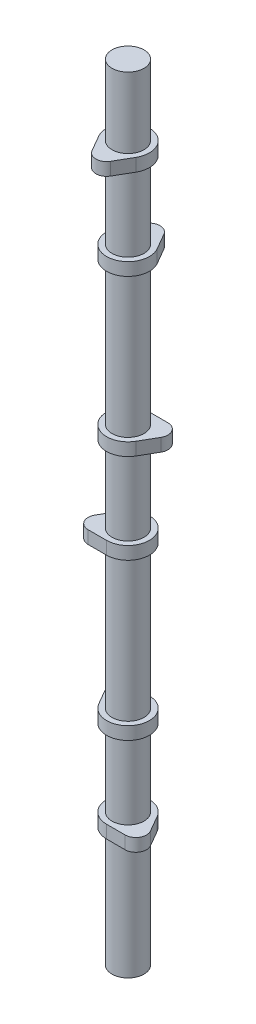
ISO-10303-21;
HEADER;
FILE_DESCRIPTION(('STEP AP214'),'2;1');
FILE_NAME('part.step','',(''),(''),'','','');
FILE_SCHEMA(('AUTOMOTIVE_DESIGN { 1 0 10303 214 1 1 1 1 }'));
ENDSEC;
DATA;
#1=APPLICATION_CONTEXT('core data for automotive mechanical design processes');
#2=APPLICATION_PROTOCOL_DEFINITION('international standard','automotive_design',2000,#1);
#3=PRODUCT_CONTEXT('',#1,'mechanical');
#4=PRODUCT('Part','Part','',(#3));
#5=PRODUCT_RELATED_PRODUCT_CATEGORY('part','',(#4));
#6=PRODUCT_DEFINITION_FORMATION('','',#4);
#7=PRODUCT_DEFINITION_CONTEXT('part definition',#1,'design');
#8=PRODUCT_DEFINITION('design','',#6,#7);
#9=PRODUCT_DEFINITION_SHAPE('','',#8);
#10=(LENGTH_UNIT() NAMED_UNIT(*) SI_UNIT(.MILLI.,.METRE.));
#11=(NAMED_UNIT(*) PLANE_ANGLE_UNIT() SI_UNIT($,.RADIAN.));
#12=(NAMED_UNIT(*) SI_UNIT($,.STERADIAN.) SOLID_ANGLE_UNIT());
#13=UNCERTAINTY_MEASURE_WITH_UNIT(LENGTH_MEASURE(1.E-05),#10,'distance_accuracy_value','');
#14=(GEOMETRIC_REPRESENTATION_CONTEXT(3) GLOBAL_UNCERTAINTY_ASSIGNED_CONTEXT((#13)) GLOBAL_UNIT_ASSIGNED_CONTEXT((#10,
#11,#12)) REPRESENTATION_CONTEXT('',''));
#15=CARTESIAN_POINT('',(0.,0.,0.));
#16=DIRECTION('',(0.,0.,1.));
#17=DIRECTION('',(1.,0.,0.));
#18=AXIS2_PLACEMENT_3D('',#15,#16,#17);
#19=CARTESIAN_POINT('',(0.,-363.22,0.));
#20=DIRECTION('',(0.,1.,0.));
#21=DIRECTION('',(0.,0.,1.));
#22=AXIS2_PLACEMENT_3D('',#19,#20,#21);
#23=CYLINDRICAL_SURFACE('',#22,9.5);
#24=CARTESIAN_POINT('',(0.,7.62000000000002,0.));
#25=DIRECTION('',(0.,1.,0.));
#26=DIRECTION('',(0.,0.,1.));
#27=AXIS2_PLACEMENT_3D('',#24,#25,#26);
#28=CIRCLE('',#27,9.5);
#29=CARTESIAN_POINT('',(0.,7.62000000000002,9.5));
#30=VERTEX_POINT('',#29);
#31=EDGE_CURVE('E434',#30,#30,#28,.T.);
#32=ORIENTED_EDGE('',*,*,#31,.T.);
#33=EDGE_LOOP('',(#32));
#34=FACE_BOUND('',#33,.T.);
#35=CARTESIAN_POINT('',(0.,53.34,0.));
#36=DIRECTION('',(0.,1.,0.));
#37=DIRECTION('',(0.,0.,1.));
#38=AXIS2_PLACEMENT_3D('',#35,#36,#37);
#39=CIRCLE('',#38,9.5);
#40=CARTESIAN_POINT('',(0.,53.34,9.5));
#41=VERTEX_POINT('',#40);
#42=EDGE_CURVE('E424',#41,#41,#39,.F.);
#43=ORIENTED_EDGE('',*,*,#42,.T.);
#44=EDGE_LOOP('',(#43));
#45=FACE_BOUND('',#44,.T.);
#46=ADVANCED_FACE('F43',(#34,#45),#23,.T.);
#47=CARTESIAN_POINT('',(0.,7.62,0.));
#48=DIRECTION('',(0.,-1.,0.));
#49=DIRECTION('',(0.,0.,-1.));
#50=AXIS2_PLACEMENT_3D('',#47,#48,#49);
#51=CYLINDRICAL_SURFACE('',#50,12.7);
#52=CARTESIAN_POINT('',(0.,0.,0.));
#53=DIRECTION('',(0.,1.,0.));
#54=DIRECTION('',(0.,0.,1.));
#55=AXIS2_PLACEMENT_3D('',#52,#53,#54);
#56=CIRCLE('',#55,12.7);
#57=CARTESIAN_POINT('',(-10.9985226280624,0.,-6.35));
#58=VERTEX_POINT('',#57);
#59=CARTESIAN_POINT('',(10.9985226280624,0.,-6.35));
#60=VERTEX_POINT('',#59);
#61=EDGE_CURVE('E451',#58,#60,#56,.T.);
#62=ORIENTED_EDGE('',*,*,#61,.T.);
#63=DIRECTION('',(0.,-1.,0.));
#64=VECTOR('',#63,1.);
#65=CARTESIAN_POINT('',(10.9985226280624,7.62,-6.35));
#66=LINE('',#65,#64);
#67=CARTESIAN_POINT('',(10.9985226280624,7.62,-6.35));
#68=VERTEX_POINT('',#67);
#69=EDGE_CURVE('E439',#68,#60,#66,.T.);
#70=ORIENTED_EDGE('',*,*,#69,.F.);
#71=CARTESIAN_POINT('',(0.,7.62,0.));
#72=DIRECTION('',(0.,1.,0.));
#73=DIRECTION('',(0.,0.,1.));
#74=AXIS2_PLACEMENT_3D('',#71,#72,#73);
#75=CIRCLE('',#74,12.7);
#76=CARTESIAN_POINT('',(-10.9985226280624,7.62,-6.35));
#77=VERTEX_POINT('',#76);
#78=EDGE_CURVE('E440',#77,#68,#75,.T.);
#79=ORIENTED_EDGE('',*,*,#78,.F.);
#80=DIRECTION('',(0.,-1.,0.));
#81=VECTOR('',#80,1.);
#82=CARTESIAN_POINT('',(-10.9985226280624,7.62,-6.35));
#83=LINE('',#82,#81);
#84=EDGE_CURVE('E450',#77,#58,#83,.T.);
#85=ORIENTED_EDGE('',*,*,#84,.T.);
#86=EDGE_LOOP('',(#62,#70,#79,#85));
#87=FACE_BOUND('',#86,.T.);
#88=ADVANCED_FACE('F45',(#87),#51,.T.);
#89=CARTESIAN_POINT('',(10.9985226280624,7.62,-6.35));
#90=DIRECTION('',(-0.866025403784439,0.,0.5));
#91=DIRECTION('',(0.5,0.,0.866025403784439));
#92=AXIS2_PLACEMENT_3D('',#89,#90,#91);
#93=PLANE('',#92);
#94=DIRECTION('',(-0.5,0.,-0.866025403784439));
#95=VECTOR('',#94,1.);
#96=CARTESIAN_POINT('',(10.9985226280624,0.,-6.35));
#97=LINE('',#96,#95);
#98=CARTESIAN_POINT('',(5.49926131403118,0.,-15.875));
#99=VERTEX_POINT('',#98);
#100=EDGE_CURVE('E455',#60,#99,#97,.T.);
#101=ORIENTED_EDGE('',*,*,#100,.T.);
#102=DIRECTION('',(0.,-1.,0.));
#103=VECTOR('',#102,1.);
#104=CARTESIAN_POINT('',(5.49926131403118,7.62,-15.875));
#105=LINE('',#104,#103);
#106=CARTESIAN_POINT('',(5.49926131403118,7.62,-15.875));
#107=VERTEX_POINT('',#106);
#108=EDGE_CURVE('E467',#107,#99,#105,.T.);
#109=ORIENTED_EDGE('',*,*,#108,.F.);
#110=DIRECTION('',(-0.5,0.,-0.866025403784439));
#111=VECTOR('',#110,1.);
#112=CARTESIAN_POINT('',(10.9985226280624,7.62,-6.35));
#113=LINE('',#112,#111);
#114=EDGE_CURVE('E93',#68,#107,#113,.T.);
#115=ORIENTED_EDGE('',*,*,#114,.F.);
#116=ORIENTED_EDGE('',*,*,#69,.T.);
#117=EDGE_LOOP('',(#101,#109,#115,#116));
#118=FACE_BOUND('',#117,.T.);
#119=ADVANCED_FACE('F559',(#118),#93,.F.);
#120=CARTESIAN_POINT('',(0.,7.62,-12.7));
#121=DIRECTION('',(0.,-1.,0.));
#122=DIRECTION('',(0.,0.,-1.));
#123=AXIS2_PLACEMENT_3D('',#120,#121,#122);
#124=CYLINDRICAL_SURFACE('',#123,6.35);
#125=CARTESIAN_POINT('',(0.,0.,-12.7));
#126=DIRECTION('',(0.,1.,0.));
#127=DIRECTION('',(0.,0.,1.));
#128=AXIS2_PLACEMENT_3D('',#125,#126,#127);
#129=CIRCLE('',#128,6.35);
#130=CARTESIAN_POINT('',(-5.49926131403118,0.,-15.875));
#131=VERTEX_POINT('',#130);
#132=EDGE_CURVE('E79',#99,#131,#129,.T.);
#133=ORIENTED_EDGE('',*,*,#132,.T.);
#134=DIRECTION('',(0.,-1.,0.));
#135=VECTOR('',#134,1.);
#136=CARTESIAN_POINT('',(-5.49926131403118,7.62,-15.875));
#137=LINE('',#136,#135);
#138=CARTESIAN_POINT('',(-5.49926131403118,7.62,-15.875));
#139=VERTEX_POINT('',#138);
#140=EDGE_CURVE('E464',#139,#131,#137,.T.);
#141=ORIENTED_EDGE('',*,*,#140,.F.);
#142=CARTESIAN_POINT('',(0.,7.62,-12.7));
#143=DIRECTION('',(0.,1.,0.));
#144=DIRECTION('',(0.,0.,1.));
#145=AXIS2_PLACEMENT_3D('',#142,#143,#144);
#146=CIRCLE('',#145,6.35);
#147=EDGE_CURVE('E445',#107,#139,#146,.T.);
#148=ORIENTED_EDGE('',*,*,#147,.F.);
#149=ORIENTED_EDGE('',*,*,#108,.T.);
#150=EDGE_LOOP('',(#133,#141,#148,#149));
#151=FACE_BOUND('',#150,.T.);
#152=ADVANCED_FACE('F1030',(#151),#124,.T.);
#153=CARTESIAN_POINT('',(-10.9985226280624,7.62,-6.35));
#154=DIRECTION('',(0.866025403784439,0.,0.5));
#155=DIRECTION('',(0.5,0.,-0.866025403784439));
#156=AXIS2_PLACEMENT_3D('',#153,#154,#155);
#157=PLANE('',#156);
#158=DIRECTION('',(-0.5,0.,0.866025403784439));
#159=VECTOR('',#158,1.);
#160=CARTESIAN_POINT('',(-10.9985226280624,0.,-6.35));
#161=LINE('',#160,#159);
#162=EDGE_CURVE('E85',#131,#58,#161,.T.);
#163=ORIENTED_EDGE('',*,*,#162,.T.);
#164=ORIENTED_EDGE('',*,*,#84,.F.);
#165=DIRECTION('',(-0.5,0.,0.866025403784439));
#166=VECTOR('',#165,1.);
#167=CARTESIAN_POINT('',(-10.9985226280624,7.62,-6.35));
#168=LINE('',#167,#166);
#169=EDGE_CURVE('E61',#139,#77,#168,.T.);
#170=ORIENTED_EDGE('',*,*,#169,.F.);
#171=ORIENTED_EDGE('',*,*,#140,.T.);
#172=EDGE_LOOP('',(#163,#164,#170,#171));
#173=FACE_BOUND('',#172,.T.);
#174=ADVANCED_FACE('F1021',(#173),#157,.F.);
#175=CARTESIAN_POINT('',(0.,7.62,0.));
#176=DIRECTION('',(0.,1.,0.));
#177=DIRECTION('',(0.,0.,1.));
#178=AXIS2_PLACEMENT_3D('',#175,#176,#177);
#179=PLANE('',#178);
#180=ORIENTED_EDGE('',*,*,#31,.F.);
#181=EDGE_LOOP('',(#180));
#182=FACE_BOUND('',#181,.T.);
#183=ORIENTED_EDGE('',*,*,#78,.T.);
#184=ORIENTED_EDGE('',*,*,#114,.T.);
#185=ORIENTED_EDGE('',*,*,#147,.T.);
#186=ORIENTED_EDGE('',*,*,#169,.T.);
#187=EDGE_LOOP('',(#183,#184,#185,#186));
#188=FACE_BOUND('',#187,.T.);
#189=ADVANCED_FACE('F1011',(#182,#188),#179,.T.);
#190=CARTESIAN_POINT('',(0.,0.,0.));
#191=DIRECTION('',(0.,1.,0.));
#192=DIRECTION('',(0.,0.,1.));
#193=AXIS2_PLACEMENT_3D('',#190,#191,#192);
#194=PLANE('',#193);
#195=CARTESIAN_POINT('',(0.,0.,0.));
#196=DIRECTION('',(0.,1.,0.));
#197=DIRECTION('',(0.,0.,1.));
#198=AXIS2_PLACEMENT_3D('',#195,#196,#197);
#199=CIRCLE('',#198,9.5);
#200=CARTESIAN_POINT('',(0.,0.,9.5));
#201=VERTEX_POINT('',#200);
#202=EDGE_CURVE('E429',#201,#201,#199,.T.);
#203=ORIENTED_EDGE('',*,*,#202,.T.);
#204=EDGE_LOOP('',(#203));
#205=FACE_BOUND('',#204,.T.);
#206=ORIENTED_EDGE('',*,*,#61,.F.);
#207=ORIENTED_EDGE('',*,*,#162,.F.);
#208=ORIENTED_EDGE('',*,*,#132,.F.);
#209=ORIENTED_EDGE('',*,*,#100,.F.);
#210=EDGE_LOOP('',(#206,#207,#208,#209));
#211=FACE_BOUND('',#210,.T.);
#212=ADVANCED_FACE('F566',(#205,#211),#194,.F.);
#213=CARTESIAN_POINT('',(0.,-85.09,0.));
#214=DIRECTION('',(0.,1.,0.));
#215=DIRECTION('',(0.,0.,1.));
#216=AXIS2_PLACEMENT_3D('',#213,#214,#215);
#217=CIRCLE('',#216,9.5);
#218=CARTESIAN_POINT('',(0.,-85.09,9.5));
#219=VERTEX_POINT('',#218);
#220=EDGE_CURVE('E488',#219,#219,#217,.F.);
#221=ORIENTED_EDGE('',*,*,#220,.F.);
#222=EDGE_LOOP('',(#221));
#223=FACE_BOUND('',#222,.T.);
#224=ORIENTED_EDGE('',*,*,#202,.F.);
#225=EDGE_LOOP('',(#224));
#226=FACE_BOUND('',#225,.T.);
#227=ADVANCED_FACE('F554',(#223,#226),#23,.T.);
#228=CARTESIAN_POINT('',(0.,60.96,0.));
#229=DIRECTION('',(0.,-1.,0.));
#230=DIRECTION('',(0.,0.,1.));
#231=AXIS2_PLACEMENT_3D('',#228,#229,#230);
#232=CYLINDRICAL_SURFACE('',#231,12.7);
#233=CARTESIAN_POINT('',(0.,53.34,0.));
#234=DIRECTION('',(0.,1.,0.));
#235=DIRECTION('',(0.,0.,-1.));
#236=AXIS2_PLACEMENT_3D('',#233,#234,#235);
#237=CIRCLE('',#236,12.7);
#238=CARTESIAN_POINT('',(10.9985226280623,53.34,6.35000000000008));
#239=VERTEX_POINT('',#238);
#240=CARTESIAN_POINT('',(-10.9985226280624,53.34,6.34999999999992));
#241=VERTEX_POINT('',#240);
#242=EDGE_CURVE('E397',#239,#241,#237,.T.);
#243=ORIENTED_EDGE('',*,*,#242,.T.);
#244=DIRECTION('',(0.,-1.,0.));
#245=VECTOR('',#244,1.);
#246=CARTESIAN_POINT('',(-10.9985226280624,60.96,6.34999999999992));
#247=LINE('',#246,#245);
#248=CARTESIAN_POINT('',(-10.9985226280624,60.96,6.34999999999992));
#249=VERTEX_POINT('',#248);
#250=EDGE_CURVE('E420',#249,#241,#247,.T.);
#251=ORIENTED_EDGE('',*,*,#250,.F.);
#252=CARTESIAN_POINT('',(0.,60.96,0.));
#253=DIRECTION('',(0.,1.,0.));
#254=DIRECTION('',(0.,0.,-1.));
#255=AXIS2_PLACEMENT_3D('',#252,#253,#254);
#256=CIRCLE('',#255,12.7);
#257=CARTESIAN_POINT('',(10.9985226280623,60.96,6.35000000000008));
#258=VERTEX_POINT('',#257);
#259=EDGE_CURVE('E382',#258,#249,#256,.T.);
#260=ORIENTED_EDGE('',*,*,#259,.F.);
#261=DIRECTION('',(0.,-1.,0.));
#262=VECTOR('',#261,1.);
#263=CARTESIAN_POINT('',(10.9985226280623,60.96,6.35000000000008));
#264=LINE('',#263,#262);
#265=EDGE_CURVE('E396',#258,#239,#264,.T.);
#266=ORIENTED_EDGE('',*,*,#265,.T.);
#267=EDGE_LOOP('',(#243,#251,#260,#266));
#268=FACE_BOUND('',#267,.T.);
#269=ADVANCED_FACE('F565',(#268),#232,.T.);
#270=CARTESIAN_POINT('',(-10.9985226280624,60.96,6.34999999999992));
#271=DIRECTION('',(0.866025403784442,0.,-0.499999999999994));
#272=DIRECTION('',(-0.499999999999994,0.,-0.866025403784442));
#273=AXIS2_PLACEMENT_3D('',#270,#271,#272);
#274=PLANE('',#273);
#275=DIRECTION('',(0.499999999999994,0.,0.866025403784442));
#276=VECTOR('',#275,1.);
#277=CARTESIAN_POINT('',(-10.9985226280624,53.34,6.34999999999992));
#278=LINE('',#277,#276);
#279=CARTESIAN_POINT('',(-5.49926131403129,53.34,15.875));
#280=VERTEX_POINT('',#279);
#281=EDGE_CURVE('E401',#241,#280,#278,.T.);
#282=ORIENTED_EDGE('',*,*,#281,.T.);
#283=DIRECTION('',(0.,-1.,0.));
#284=VECTOR('',#283,1.);
#285=CARTESIAN_POINT('',(-5.49926131403129,60.96,15.875));
#286=LINE('',#285,#284);
#287=CARTESIAN_POINT('',(-5.49926131403129,60.96,15.875));
#288=VERTEX_POINT('',#287);
#289=EDGE_CURVE('E416',#288,#280,#286,.T.);
#290=ORIENTED_EDGE('',*,*,#289,.F.);
#291=DIRECTION('',(0.499999999999994,0.,0.866025403784442));
#292=VECTOR('',#291,1.);
#293=CARTESIAN_POINT('',(-10.9985226280624,60.96,6.34999999999992));
#294=LINE('',#293,#292);
#295=EDGE_CURVE('E386',#249,#288,#294,.T.);
#296=ORIENTED_EDGE('',*,*,#295,.F.);
#297=ORIENTED_EDGE('',*,*,#250,.T.);
#298=EDGE_LOOP('',(#282,#290,#296,#297));
#299=FACE_BOUND('',#298,.T.);
#300=ADVANCED_FACE('F693',(#299),#274,.F.);
#301=CARTESIAN_POINT('',(0.,60.96,12.7));
#302=DIRECTION('',(0.,-1.,0.));
#303=DIRECTION('',(0.,0.,1.));
#304=AXIS2_PLACEMENT_3D('',#301,#302,#303);
#305=CYLINDRICAL_SURFACE('',#304,6.35);
#306=CARTESIAN_POINT('',(0.,53.34,12.7));
#307=DIRECTION('',(0.,1.,0.));
#308=DIRECTION('',(0.,0.,-1.));
#309=AXIS2_PLACEMENT_3D('',#306,#307,#308);
#310=CIRCLE('',#309,6.35);
#311=CARTESIAN_POINT('',(5.49926131403107,53.34,15.875));
#312=VERTEX_POINT('',#311);
#313=EDGE_CURVE('E404',#280,#312,#310,.T.);
#314=ORIENTED_EDGE('',*,*,#313,.T.);
#315=DIRECTION('',(0.,-1.,0.));
#316=VECTOR('',#315,1.);
#317=CARTESIAN_POINT('',(5.49926131403107,60.96,15.875));
#318=LINE('',#317,#316);
#319=CARTESIAN_POINT('',(5.49926131403107,60.96,15.875));
#320=VERTEX_POINT('',#319);
#321=EDGE_CURVE('E412',#320,#312,#318,.T.);
#322=ORIENTED_EDGE('',*,*,#321,.F.);
#323=CARTESIAN_POINT('',(0.,60.96,12.7));
#324=DIRECTION('',(0.,1.,0.));
#325=DIRECTION('',(0.,0.,-1.));
#326=AXIS2_PLACEMENT_3D('',#323,#324,#325);
#327=CIRCLE('',#326,6.35);
#328=EDGE_CURVE('E390',#288,#320,#327,.T.);
#329=ORIENTED_EDGE('',*,*,#328,.F.);
#330=ORIENTED_EDGE('',*,*,#289,.T.);
#331=EDGE_LOOP('',(#314,#322,#329,#330));
#332=FACE_BOUND('',#331,.T.);
#333=ADVANCED_FACE('F689',(#332),#305,.T.);
#334=CARTESIAN_POINT('',(10.9985226280623,60.96,6.35000000000008));
#335=DIRECTION('',(-0.866025403784435,0.,-0.500000000000006));
#336=DIRECTION('',(-0.500000000000006,0.,0.866025403784435));
#337=AXIS2_PLACEMENT_3D('',#334,#335,#336);
#338=PLANE('',#337);
#339=DIRECTION('',(0.500000000000006,0.,-0.866025403784435));
#340=VECTOR('',#339,1.);
#341=CARTESIAN_POINT('',(10.9985226280623,53.34,6.35000000000008));
#342=LINE('',#341,#340);
#343=EDGE_CURVE('E387',#312,#239,#342,.T.);
#344=ORIENTED_EDGE('',*,*,#343,.T.);
#345=ORIENTED_EDGE('',*,*,#265,.F.);
#346=DIRECTION('',(0.500000000000006,0.,-0.866025403784435));
#347=VECTOR('',#346,1.);
#348=CARTESIAN_POINT('',(10.9985226280623,60.96,6.35000000000008));
#349=LINE('',#348,#347);
#350=EDGE_CURVE('E393',#320,#258,#349,.T.);
#351=ORIENTED_EDGE('',*,*,#350,.F.);
#352=ORIENTED_EDGE('',*,*,#321,.T.);
#353=EDGE_LOOP('',(#344,#345,#351,#352));
#354=FACE_BOUND('',#353,.T.);
#355=ADVANCED_FACE('F681',(#354),#338,.F.);
#356=CARTESIAN_POINT('',(0.,60.96,0.));
#357=DIRECTION('',(0.,1.,0.));
#358=DIRECTION('',(0.,0.,-1.));
#359=AXIS2_PLACEMENT_3D('',#356,#357,#358);
#360=PLANE('',#359);
#361=CARTESIAN_POINT('',(0.,60.96,0.));
#362=DIRECTION('',(0.,1.,0.));
#363=DIRECTION('',(0.,0.,1.));
#364=AXIS2_PLACEMENT_3D('',#361,#362,#363);
#365=CIRCLE('',#364,9.5);
#366=CARTESIAN_POINT('',(0.,60.96,9.5));
#367=VERTEX_POINT('',#366);
#368=EDGE_CURVE('E438',#367,#367,#365,.F.);
#369=ORIENTED_EDGE('',*,*,#368,.T.);
#370=EDGE_LOOP('',(#369));
#371=FACE_BOUND('',#370,.T.);
#372=ORIENTED_EDGE('',*,*,#259,.T.);
#373=ORIENTED_EDGE('',*,*,#295,.T.);
#374=ORIENTED_EDGE('',*,*,#328,.T.);
#375=ORIENTED_EDGE('',*,*,#350,.T.);
#376=EDGE_LOOP('',(#372,#373,#374,#375));
#377=FACE_BOUND('',#376,.T.);
#378=ADVANCED_FACE('F677',(#371,#377),#360,.T.);
#379=CARTESIAN_POINT('',(0.,53.34,0.));
#380=DIRECTION('',(0.,1.,0.));
#381=DIRECTION('',(0.,0.,-1.));
#382=AXIS2_PLACEMENT_3D('',#379,#380,#381);
#383=PLANE('',#382);
#384=ORIENTED_EDGE('',*,*,#42,.F.);
#385=EDGE_LOOP('',(#384));
#386=FACE_BOUND('',#385,.T.);
#387=ORIENTED_EDGE('',*,*,#242,.F.);
#388=ORIENTED_EDGE('',*,*,#343,.F.);
#389=ORIENTED_EDGE('',*,*,#313,.F.);
#390=ORIENTED_EDGE('',*,*,#281,.F.);
#391=EDGE_LOOP('',(#387,#388,#389,#390));
#392=FACE_BOUND('',#391,.T.);
#393=ADVANCED_FACE('F680',(#386,#392),#383,.F.);
#394=CARTESIAN_POINT('',(0.,102.87,0.));
#395=DIRECTION('',(0.,1.,0.));
#396=DIRECTION('',(0.,0.,1.));
#397=AXIS2_PLACEMENT_3D('',#394,#395,#396);
#398=PLANE('',#397);
#399=CARTESIAN_POINT('',(0.,102.87,0.));
#400=DIRECTION('',(0.,1.,0.));
#401=DIRECTION('',(0.,0.,1.));
#402=AXIS2_PLACEMENT_3D('',#399,#400,#401);
#403=CIRCLE('',#402,9.5);
#404=CARTESIAN_POINT('',(0.,102.87,9.5));
#405=VERTEX_POINT('',#404);
#406=EDGE_CURVE('E430',#405,#405,#403,.T.);
#407=ORIENTED_EDGE('',*,*,#406,.T.);
#408=EDGE_LOOP('',(#407));
#409=FACE_BOUND('',#408,.T.);
#410=ADVANCED_FACE('F685',(#409),#398,.T.);
#411=ORIENTED_EDGE('',*,*,#368,.F.);
#412=EDGE_LOOP('',(#411));
#413=FACE_BOUND('',#412,.T.);
#414=ORIENTED_EDGE('',*,*,#406,.F.);
#415=EDGE_LOOP('',(#414));
#416=FACE_BOUND('',#415,.T.);
#417=ADVANCED_FACE('F510',(#413,#416),#23,.T.);
#418=CARTESIAN_POINT('',(0.,-85.09,0.));
#419=DIRECTION('',(0.,-1.,0.));
#420=DIRECTION('',(0.86602540378444,0.,-0.499999999999998));
#421=AXIS2_PLACEMENT_3D('',#418,#419,#420);
#422=CYLINDRICAL_SURFACE('',#421,12.7);
#423=CARTESIAN_POINT('',(0.,-92.71,0.));
#424=DIRECTION('',(0.,1.,0.));
#425=DIRECTION('',(-0.86602540378444,0.,0.499999999999998));
#426=AXIS2_PLACEMENT_3D('',#423,#424,#425);
#427=CIRCLE('',#426,12.7);
#428=CARTESIAN_POINT('',(0.,-92.71,-12.7));
#429=VERTEX_POINT('',#428);
#430=CARTESIAN_POINT('',(10.9985226280624,-92.71,6.35000000000003));
#431=VERTEX_POINT('',#430);
#432=EDGE_CURVE('E311',#429,#431,#427,.T.);
#433=ORIENTED_EDGE('',*,*,#432,.T.);
#434=DIRECTION('',(0.,-1.,0.));
#435=VECTOR('',#434,1.);
#436=CARTESIAN_POINT('',(10.9985226280624,-85.09,6.35000000000003));
#437=LINE('',#436,#435);
#438=CARTESIAN_POINT('',(10.9985226280624,-85.09,6.35000000000003));
#439=VERTEX_POINT('',#438);
#440=EDGE_CURVE('E334',#439,#431,#437,.T.);
#441=ORIENTED_EDGE('',*,*,#440,.F.);
#442=CARTESIAN_POINT('',(0.,-85.09,0.));
#443=DIRECTION('',(0.,1.,0.));
#444=DIRECTION('',(-0.86602540378444,0.,0.499999999999998));
#445=AXIS2_PLACEMENT_3D('',#442,#443,#444);
#446=CIRCLE('',#445,12.7);
#447=CARTESIAN_POINT('',(0.,-85.09,-12.7));
#448=VERTEX_POINT('',#447);
#449=EDGE_CURVE('E296',#448,#439,#446,.T.);
#450=ORIENTED_EDGE('',*,*,#449,.F.);
#451=DIRECTION('',(0.,-1.,0.));
#452=VECTOR('',#451,1.);
#453=CARTESIAN_POINT('',(0.,-85.09,-12.7));
#454=LINE('',#453,#452);
#455=EDGE_CURVE('E310',#448,#429,#454,.T.);
#456=ORIENTED_EDGE('',*,*,#455,.T.);
#457=EDGE_LOOP('',(#433,#441,#450,#456));
#458=FACE_BOUND('',#457,.T.);
#459=ADVANCED_FACE('F658',(#458),#422,.T.);
#460=CARTESIAN_POINT('',(10.9985226280624,-85.09,6.35000000000003));
#461=DIRECTION('',(-0.866025403784438,0.,-0.500000000000002));
#462=DIRECTION('',(-0.500000000000002,0.,0.866025403784438));
#463=AXIS2_PLACEMENT_3D('',#460,#461,#462);
#464=PLANE('',#463);
#465=DIRECTION('',(0.500000000000002,0.,-0.866025403784438));
#466=VECTOR('',#465,1.);
#467=CARTESIAN_POINT('',(10.9985226280624,-92.71,6.35000000000003));
#468=LINE('',#467,#466);
#469=CARTESIAN_POINT('',(16.4977839420936,-92.71,-3.17499999999996));
#470=VERTEX_POINT('',#469);
#471=EDGE_CURVE('E315',#431,#470,#468,.T.);
#472=ORIENTED_EDGE('',*,*,#471,.T.);
#473=DIRECTION('',(0.,-1.,0.));
#474=VECTOR('',#473,1.);
#475=CARTESIAN_POINT('',(16.4977839420936,-85.09,-3.17499999999996));
#476=LINE('',#475,#474);
#477=CARTESIAN_POINT('',(16.4977839420936,-85.09,-3.17499999999996));
#478=VERTEX_POINT('',#477);
#479=EDGE_CURVE('E330',#478,#470,#476,.T.);
#480=ORIENTED_EDGE('',*,*,#479,.F.);
#481=DIRECTION('',(0.500000000000002,0.,-0.866025403784438));
#482=VECTOR('',#481,1.);
#483=CARTESIAN_POINT('',(10.9985226280624,-85.09,6.35000000000003));
#484=LINE('',#483,#482);
#485=EDGE_CURVE('E300',#439,#478,#484,.T.);
#486=ORIENTED_EDGE('',*,*,#485,.F.);
#487=ORIENTED_EDGE('',*,*,#440,.T.);
#488=EDGE_LOOP('',(#472,#480,#486,#487));
#489=FACE_BOUND('',#488,.T.);
#490=ADVANCED_FACE('F654',(#489),#464,.F.);
#491=CARTESIAN_POINT('',(10.9985226280624,-85.09,-6.34999999999997));
#492=DIRECTION('',(0.,-1.,0.));
#493=DIRECTION('',(0.86602540378444,0.,-0.499999999999998));
#494=AXIS2_PLACEMENT_3D('',#491,#492,#493);
#495=CYLINDRICAL_SURFACE('',#494,6.35);
#496=CARTESIAN_POINT('',(10.9985226280624,-92.71,-6.34999999999997));
#497=DIRECTION('',(0.,1.,0.));
#498=DIRECTION('',(-0.86602540378444,0.,0.499999999999998));
#499=AXIS2_PLACEMENT_3D('',#496,#497,#498);
#500=CIRCLE('',#499,6.35);
#501=CARTESIAN_POINT('',(10.9985226280624,-92.71,-12.7));
#502=VERTEX_POINT('',#501);
#503=EDGE_CURVE('E318',#470,#502,#500,.T.);
#504=ORIENTED_EDGE('',*,*,#503,.T.);
#505=DIRECTION('',(0.,-1.,0.));
#506=VECTOR('',#505,1.);
#507=CARTESIAN_POINT('',(10.9985226280624,-85.09,-12.7));
#508=LINE('',#507,#506);
#509=CARTESIAN_POINT('',(10.9985226280624,-85.09,-12.7));
#510=VERTEX_POINT('',#509);
#511=EDGE_CURVE('E326',#510,#502,#508,.T.);
#512=ORIENTED_EDGE('',*,*,#511,.F.);
#513=CARTESIAN_POINT('',(10.9985226280624,-85.09,-6.34999999999997));
#514=DIRECTION('',(0.,1.,0.));
#515=DIRECTION('',(-0.86602540378444,0.,0.499999999999998));
#516=AXIS2_PLACEMENT_3D('',#513,#514,#515);
#517=CIRCLE('',#516,6.35);
#518=EDGE_CURVE('E304',#478,#510,#517,.T.);
#519=ORIENTED_EDGE('',*,*,#518,.F.);
#520=ORIENTED_EDGE('',*,*,#479,.T.);
#521=EDGE_LOOP('',(#504,#512,#519,#520));
#522=FACE_BOUND('',#521,.T.);
#523=ADVANCED_FACE('F650',(#522),#495,.T.);
#524=CARTESIAN_POINT('',(0.,-85.09,-12.7));
#525=DIRECTION('',(0.,0.,1.));
#526=DIRECTION('',(1.,0.,0.));
#527=AXIS2_PLACEMENT_3D('',#524,#525,#526);
#528=PLANE('',#527);
#529=DIRECTION('',(-1.,0.,0.));
#530=VECTOR('',#529,1.);
#531=CARTESIAN_POINT('',(0.,-92.71,-12.7));
#532=LINE('',#531,#530);
#533=EDGE_CURVE('E301',#502,#429,#532,.T.);
#534=ORIENTED_EDGE('',*,*,#533,.T.);
#535=ORIENTED_EDGE('',*,*,#455,.F.);
#536=DIRECTION('',(-1.,0.,0.));
#537=VECTOR('',#536,1.);
#538=CARTESIAN_POINT('',(0.,-85.09,-12.7));
#539=LINE('',#538,#537);
#540=EDGE_CURVE('E307',#510,#448,#539,.T.);
#541=ORIENTED_EDGE('',*,*,#540,.F.);
#542=ORIENTED_EDGE('',*,*,#511,.T.);
#543=EDGE_LOOP('',(#534,#535,#541,#542));
#544=FACE_BOUND('',#543,.T.);
#545=ADVANCED_FACE('F645',(#544),#528,.F.);
#546=CARTESIAN_POINT('',(0.,-85.09,0.));
#547=DIRECTION('',(0.,1.,0.));
#548=DIRECTION('',(-0.86602540378444,0.,0.499999999999998));
#549=AXIS2_PLACEMENT_3D('',#546,#547,#548);
#550=PLANE('',#549);
#551=ORIENTED_EDGE('',*,*,#220,.T.);
#552=EDGE_LOOP('',(#551));
#553=FACE_BOUND('',#552,.T.);
#554=ORIENTED_EDGE('',*,*,#449,.T.);
#555=ORIENTED_EDGE('',*,*,#485,.T.);
#556=ORIENTED_EDGE('',*,*,#518,.T.);
#557=ORIENTED_EDGE('',*,*,#540,.T.);
#558=EDGE_LOOP('',(#554,#555,#556,#557));
#559=FACE_BOUND('',#558,.T.);
#560=ADVANCED_FACE('F580',(#553,#559),#550,.T.);
#561=CARTESIAN_POINT('',(0.,-92.71,0.));
#562=DIRECTION('',(0.,1.,0.));
#563=DIRECTION('',(-0.86602540378444,0.,0.499999999999998));
#564=AXIS2_PLACEMENT_3D('',#561,#562,#563);
#565=PLANE('',#564);
#566=CARTESIAN_POINT('',(0.,-92.71,0.));
#567=DIRECTION('',(0.,1.,0.));
#568=DIRECTION('',(0.,0.,1.));
#569=AXIS2_PLACEMENT_3D('',#566,#567,#568);
#570=CIRCLE('',#569,9.5);
#571=CARTESIAN_POINT('',(0.,-92.71,9.5));
#572=VERTEX_POINT('',#571);
#573=EDGE_CURVE('E338',#572,#572,#570,.F.);
#574=ORIENTED_EDGE('',*,*,#573,.F.);
#575=EDGE_LOOP('',(#574));
#576=FACE_BOUND('',#575,.T.);
#577=ORIENTED_EDGE('',*,*,#432,.F.);
#578=ORIENTED_EDGE('',*,*,#533,.F.);
#579=ORIENTED_EDGE('',*,*,#503,.F.);
#580=ORIENTED_EDGE('',*,*,#471,.F.);
#581=EDGE_LOOP('',(#577,#578,#579,#580));
#582=FACE_BOUND('',#581,.T.);
#583=ADVANCED_FACE('F570',(#576,#582),#565,.F.);
#584=CARTESIAN_POINT('',(0.,-231.14,0.));
#585=DIRECTION('',(0.,1.,0.));
#586=DIRECTION('',(0.,0.,1.));
#587=AXIS2_PLACEMENT_3D('',#584,#585,#586);
#588=CIRCLE('',#587,9.5);
#589=CARTESIAN_POINT('',(0.,-231.14,9.5));
#590=VERTEX_POINT('',#589);
#591=EDGE_CURVE('E11',#590,#590,#588,.F.);
#592=ORIENTED_EDGE('',*,*,#591,.F.);
#593=EDGE_LOOP('',(#592));
#594=FACE_BOUND('',#593,.T.);
#595=CARTESIAN_POINT('',(0.,-146.05,0.));
#596=DIRECTION('',(0.,1.,0.));
#597=DIRECTION('',(0.,0.,1.));
#598=AXIS2_PLACEMENT_3D('',#595,#596,#597);
#599=CIRCLE('',#598,9.5);
#600=CARTESIAN_POINT('',(0.,-146.05,9.5));
#601=VERTEX_POINT('',#600);
#602=EDGE_CURVE('E381',#601,#601,#599,.F.);
#603=ORIENTED_EDGE('',*,*,#602,.T.);
#604=EDGE_LOOP('',(#603));
#605=FACE_BOUND('',#604,.T.);
#606=ADVANCED_FACE('F555',(#594,#605),#23,.T.);
#607=CARTESIAN_POINT('',(0.,-146.05,0.));
#608=DIRECTION('',(0.,1.,0.));
#609=DIRECTION('',(0.866025403784436,0.,-0.500000000000004));
#610=AXIS2_PLACEMENT_3D('',#607,#608,#609);
#611=PLANE('',#610);
#612=ORIENTED_EDGE('',*,*,#602,.F.);
#613=EDGE_LOOP('',(#612));
#614=FACE_BOUND('',#613,.T.);
#615=CARTESIAN_POINT('',(0.,-146.05,0.));
#616=DIRECTION('',(0.,1.,0.));
#617=DIRECTION('',(0.866025403784436,0.,-0.500000000000004));
#618=AXIS2_PLACEMENT_3D('',#615,#616,#617);
#619=CIRCLE('',#618,12.7);
#620=CARTESIAN_POINT('',(0.,-146.05,12.7));
#621=VERTEX_POINT('',#620);
#622=CARTESIAN_POINT('',(-10.9985226280624,-146.05,-6.34999999999995));
#623=VERTEX_POINT('',#622);
#624=EDGE_CURVE('E354',#621,#623,#619,.T.);
#625=ORIENTED_EDGE('',*,*,#624,.F.);
#626=DIRECTION('',(1.,0.,0.));
#627=VECTOR('',#626,1.);
#628=CARTESIAN_POINT('',(0.,-146.05,12.7));
#629=LINE('',#628,#627);
#630=CARTESIAN_POINT('',(-10.9985226280623,-146.05,12.7000000000001));
#631=VERTEX_POINT('',#630);
#632=EDGE_CURVE('E344',#631,#621,#629,.T.);
#633=ORIENTED_EDGE('',*,*,#632,.F.);
#634=CARTESIAN_POINT('',(-10.9985226280623,-146.05,6.35000000000005));
#635=DIRECTION('',(0.,1.,0.));
#636=DIRECTION('',(0.866025403784436,0.,-0.500000000000004));
#637=AXIS2_PLACEMENT_3D('',#634,#635,#636);
#638=CIRCLE('',#637,6.35);
#639=CARTESIAN_POINT('',(-16.4977839420935,-146.05,3.17500000000008));
#640=VERTEX_POINT('',#639);
#641=EDGE_CURVE('E361',#640,#631,#638,.T.);
#642=ORIENTED_EDGE('',*,*,#641,.F.);
#643=DIRECTION('',(-0.499999999999996,0.,0.866025403784441));
#644=VECTOR('',#643,1.);
#645=CARTESIAN_POINT('',(-10.9985226280624,-146.05,-6.34999999999995));
#646=LINE('',#645,#644);
#647=EDGE_CURVE('E358',#623,#640,#646,.T.);
#648=ORIENTED_EDGE('',*,*,#647,.F.);
#649=EDGE_LOOP('',(#625,#633,#642,#648));
#650=FACE_BOUND('',#649,.T.);
#651=ADVANCED_FACE('F569',(#614,#650),#611,.F.);
#652=CARTESIAN_POINT('',(0.,-138.43,12.7));
#653=DIRECTION('',(0.,0.,-1.));
#654=DIRECTION('',(-1.,0.,0.));
#655=AXIS2_PLACEMENT_3D('',#652,#653,#654);
#656=PLANE('',#655);
#657=ORIENTED_EDGE('',*,*,#632,.T.);
#658=DIRECTION('',(0.,-1.,0.));
#659=VECTOR('',#658,1.);
#660=CARTESIAN_POINT('',(0.,-138.43,12.7));
#661=LINE('',#660,#659);
#662=CARTESIAN_POINT('',(0.,-138.43,12.7));
#663=VERTEX_POINT('',#662);
#664=EDGE_CURVE('E353',#663,#621,#661,.T.);
#665=ORIENTED_EDGE('',*,*,#664,.F.);
#666=DIRECTION('',(1.,0.,0.));
#667=VECTOR('',#666,1.);
#668=CARTESIAN_POINT('',(0.,-138.43,12.7));
#669=LINE('',#668,#667);
#670=CARTESIAN_POINT('',(-10.9985226280623,-138.43,12.7000000000001));
#671=VERTEX_POINT('',#670);
#672=EDGE_CURVE('E350',#671,#663,#669,.T.);
#673=ORIENTED_EDGE('',*,*,#672,.F.);
#674=DIRECTION('',(0.,-1.,0.));
#675=VECTOR('',#674,1.);
#676=CARTESIAN_POINT('',(-10.9985226280623,-138.43,12.7000000000001));
#677=LINE('',#676,#675);
#678=EDGE_CURVE('E369',#671,#631,#677,.T.);
#679=ORIENTED_EDGE('',*,*,#678,.T.);
#680=EDGE_LOOP('',(#657,#665,#673,#679));
#681=FACE_BOUND('',#680,.T.);
#682=ADVANCED_FACE('F577',(#681),#656,.F.);
#683=CARTESIAN_POINT('',(-10.9985226280623,-138.43,6.35000000000005));
#684=DIRECTION('',(0.,-1.,0.));
#685=DIRECTION('',(-0.866025403784436,0.,0.500000000000004));
#686=AXIS2_PLACEMENT_3D('',#683,#684,#685);
#687=CYLINDRICAL_SURFACE('',#686,6.35);
#688=ORIENTED_EDGE('',*,*,#641,.T.);
#689=ORIENTED_EDGE('',*,*,#678,.F.);
#690=CARTESIAN_POINT('',(-10.9985226280623,-138.43,6.35000000000005));
#691=DIRECTION('',(0.,1.,0.));
#692=DIRECTION('',(0.866025403784436,0.,-0.500000000000004));
#693=AXIS2_PLACEMENT_3D('',#690,#691,#692);
#694=CIRCLE('',#693,6.35);
#695=CARTESIAN_POINT('',(-16.4977839420935,-138.43,3.17500000000008));
#696=VERTEX_POINT('',#695);
#697=EDGE_CURVE('E347',#696,#671,#694,.T.);
#698=ORIENTED_EDGE('',*,*,#697,.F.);
#699=DIRECTION('',(0.,-1.,0.));
#700=VECTOR('',#699,1.);
#701=CARTESIAN_POINT('',(-16.4977839420935,-138.43,3.17500000000008));
#702=LINE('',#701,#700);
#703=EDGE_CURVE('E373',#696,#640,#702,.T.);
#704=ORIENTED_EDGE('',*,*,#703,.T.);
#705=EDGE_LOOP('',(#688,#689,#698,#704));
#706=FACE_BOUND('',#705,.T.);
#707=ADVANCED_FACE('F665',(#706),#687,.T.);
#708=CARTESIAN_POINT('',(-10.9985226280624,-138.43,-6.34999999999995));
#709=DIRECTION('',(0.866025403784441,0.,0.499999999999996));
#710=DIRECTION('',(0.499999999999996,0.,-0.866025403784441));
#711=AXIS2_PLACEMENT_3D('',#708,#709,#710);
#712=PLANE('',#711);
#713=ORIENTED_EDGE('',*,*,#647,.T.);
#714=ORIENTED_EDGE('',*,*,#703,.F.);
#715=DIRECTION('',(-0.499999999999996,0.,0.866025403784441));
#716=VECTOR('',#715,1.);
#717=CARTESIAN_POINT('',(-10.9985226280624,-138.43,-6.34999999999995));
#718=LINE('',#717,#716);
#719=CARTESIAN_POINT('',(-10.9985226280624,-138.43,-6.34999999999995));
#720=VERTEX_POINT('',#719);
#721=EDGE_CURVE('E343',#720,#696,#718,.T.);
#722=ORIENTED_EDGE('',*,*,#721,.F.);
#723=DIRECTION('',(0.,-1.,0.));
#724=VECTOR('',#723,1.);
#725=CARTESIAN_POINT('',(-10.9985226280624,-138.43,-6.34999999999995));
#726=LINE('',#725,#724);
#727=EDGE_CURVE('E377',#720,#623,#726,.T.);
#728=ORIENTED_EDGE('',*,*,#727,.T.);
#729=EDGE_LOOP('',(#713,#714,#722,#728));
#730=FACE_BOUND('',#729,.T.);
#731=ADVANCED_FACE('F669',(#730),#712,.F.);
#732=CARTESIAN_POINT('',(0.,-138.43,0.));
#733=DIRECTION('',(0.,-1.,0.));
#734=DIRECTION('',(-0.866025403784436,0.,0.500000000000004));
#735=AXIS2_PLACEMENT_3D('',#732,#733,#734);
#736=CYLINDRICAL_SURFACE('',#735,12.7);
#737=ORIENTED_EDGE('',*,*,#624,.T.);
#738=ORIENTED_EDGE('',*,*,#727,.F.);
#739=CARTESIAN_POINT('',(0.,-138.43,0.));
#740=DIRECTION('',(0.,1.,0.));
#741=DIRECTION('',(0.866025403784436,0.,-0.500000000000004));
#742=AXIS2_PLACEMENT_3D('',#739,#740,#741);
#743=CIRCLE('',#742,12.7);
#744=EDGE_CURVE('E339',#663,#720,#743,.T.);
#745=ORIENTED_EDGE('',*,*,#744,.F.);
#746=ORIENTED_EDGE('',*,*,#664,.T.);
#747=EDGE_LOOP('',(#737,#738,#745,#746));
#748=FACE_BOUND('',#747,.T.);
#749=ADVANCED_FACE('F593',(#748),#736,.T.);
#750=CARTESIAN_POINT('',(0.,-138.43,0.));
#751=DIRECTION('',(0.,1.,0.));
#752=DIRECTION('',(0.866025403784436,0.,-0.500000000000004));
#753=AXIS2_PLACEMENT_3D('',#750,#751,#752);
#754=PLANE('',#753);
#755=CARTESIAN_POINT('',(0.,-138.43,0.));
#756=DIRECTION('',(0.,1.,0.));
#757=DIRECTION('',(0.,0.,1.));
#758=AXIS2_PLACEMENT_3D('',#755,#756,#757);
#759=CIRCLE('',#758,9.5);
#760=CARTESIAN_POINT('',(0.,-138.43,9.5));
#761=VERTEX_POINT('',#760);
#762=EDGE_CURVE('E481',#761,#761,#759,.F.);
#763=ORIENTED_EDGE('',*,*,#762,.T.);
#764=EDGE_LOOP('',(#763));
#765=FACE_BOUND('',#764,.T.);
#766=ORIENTED_EDGE('',*,*,#744,.T.);
#767=ORIENTED_EDGE('',*,*,#721,.T.);
#768=ORIENTED_EDGE('',*,*,#697,.T.);
#769=ORIENTED_EDGE('',*,*,#672,.T.);
#770=EDGE_LOOP('',(#766,#767,#768,#769));
#771=FACE_BOUND('',#770,.T.);
#772=ADVANCED_FACE('F586',(#765,#771),#754,.T.);
#773=ORIENTED_EDGE('',*,*,#762,.F.);
#774=EDGE_LOOP('',(#773));
#775=FACE_BOUND('',#774,.T.);
#776=ORIENTED_EDGE('',*,*,#573,.T.);
#777=EDGE_LOOP('',(#776));
#778=FACE_BOUND('',#777,.T.);
#779=ADVANCED_FACE('F572',(#775,#778),#23,.T.);
#780=CARTESIAN_POINT('',(0.,-231.14,0.));
#781=DIRECTION('',(0.,-1.,0.));
#782=DIRECTION('',(-0.866025403784433,0.,-0.50000000000001));
#783=AXIS2_PLACEMENT_3D('',#780,#781,#782);
#784=CYLINDRICAL_SURFACE('',#783,12.7);
#785=CARTESIAN_POINT('',(0.,-238.76,0.));
#786=DIRECTION('',(0.,1.,0.));
#787=DIRECTION('',(0.866025403784433,0.,0.50000000000001));
#788=AXIS2_PLACEMENT_3D('',#785,#786,#787);
#789=CIRCLE('',#788,12.7);
#790=CARTESIAN_POINT('',(-10.9985226280624,-238.76,6.34999999999987));
#791=VERTEX_POINT('',#790);
#792=CARTESIAN_POINT('',(1.47451495458029E-13,-238.76,-12.7));
#793=VERTEX_POINT('',#792);
#794=EDGE_CURVE('E242',#791,#793,#789,.T.);
#795=ORIENTED_EDGE('',*,*,#794,.T.);
#796=DIRECTION('',(0.,-1.,0.));
#797=VECTOR('',#796,1.);
#798=CARTESIAN_POINT('',(1.47451495458029E-13,-231.14,-12.7));
#799=LINE('',#798,#797);
#800=CARTESIAN_POINT('',(1.47451495458029E-13,-231.14,-12.7));
#801=VERTEX_POINT('',#800);
#802=EDGE_CURVE('E220',#801,#793,#799,.T.);
#803=ORIENTED_EDGE('',*,*,#802,.F.);
#804=CARTESIAN_POINT('',(0.,-231.14,0.));
#805=DIRECTION('',(0.,1.,0.));
#806=DIRECTION('',(0.866025403784433,0.,0.50000000000001));
#807=AXIS2_PLACEMENT_3D('',#804,#805,#806);
#808=CIRCLE('',#807,12.7);
#809=CARTESIAN_POINT('',(-10.9985226280624,-231.14,6.34999999999987));
#810=VERTEX_POINT('',#809);
#811=EDGE_CURVE('E228',#810,#801,#808,.T.);
#812=ORIENTED_EDGE('',*,*,#811,.F.);
#813=DIRECTION('',(0.,-1.,0.));
#814=VECTOR('',#813,1.);
#815=CARTESIAN_POINT('',(-10.9985226280624,-231.14,6.34999999999987));
#816=LINE('',#815,#814);
#817=EDGE_CURVE('E533',#810,#791,#816,.T.);
#818=ORIENTED_EDGE('',*,*,#817,.T.);
#819=EDGE_LOOP('',(#795,#803,#812,#818));
#820=FACE_BOUND('',#819,.T.);
#821=ADVANCED_FACE('F240',(#820),#784,.T.);
#822=CARTESIAN_POINT('',(1.47451495458029E-13,-231.14,-12.7));
#823=DIRECTION('',(0.,0.,1.));
#824=DIRECTION('',(1.,0.,0.));
#825=AXIS2_PLACEMENT_3D('',#822,#823,#824);
#826=PLANE('',#825);
#827=DIRECTION('',(-1.,0.,0.));
#828=VECTOR('',#827,1.);
#829=CARTESIAN_POINT('',(1.47451495458029E-13,-238.76,-12.7));
#830=LINE('',#829,#828);
#831=CARTESIAN_POINT('',(-10.9985226280622,-238.76,-12.7000000000001));
#832=VERTEX_POINT('',#831);
#833=EDGE_CURVE('E520',#793,#832,#830,.T.);
#834=ORIENTED_EDGE('',*,*,#833,.T.);
#835=DIRECTION('',(0.,-1.,0.));
#836=VECTOR('',#835,1.);
#837=CARTESIAN_POINT('',(-10.9985226280622,-231.14,-12.7000000000001));
#838=LINE('',#837,#836);
#839=CARTESIAN_POINT('',(-10.9985226280622,-231.14,-12.7000000000001));
#840=VERTEX_POINT('',#839);
#841=EDGE_CURVE('E223',#840,#832,#838,.T.);
#842=ORIENTED_EDGE('',*,*,#841,.F.);
#843=DIRECTION('',(-1.,0.,0.));
#844=VECTOR('',#843,1.);
#845=CARTESIAN_POINT('',(1.47451495458029E-13,-231.14,-12.7));
#846=LINE('',#845,#844);
#847=EDGE_CURVE('E216',#801,#840,#846,.T.);
#848=ORIENTED_EDGE('',*,*,#847,.F.);
#849=ORIENTED_EDGE('',*,*,#802,.T.);
#850=EDGE_LOOP('',(#834,#842,#848,#849));
#851=FACE_BOUND('',#850,.T.);
#852=ADVANCED_FACE('F218',(#851),#826,.F.);
#853=CARTESIAN_POINT('',(-10.9985226280623,-231.14,-6.35000000000013));
#854=DIRECTION('',(0.,-1.,0.));
#855=DIRECTION('',(-0.866025403784433,0.,-0.50000000000001));
#856=AXIS2_PLACEMENT_3D('',#853,#854,#855);
#857=CYLINDRICAL_SURFACE('',#856,6.35);
#858=CARTESIAN_POINT('',(-10.9985226280623,-238.76,-6.35000000000013));
#859=DIRECTION('',(0.,1.,0.));
#860=DIRECTION('',(0.866025403784433,0.,0.50000000000001));
#861=AXIS2_PLACEMENT_3D('',#858,#859,#860);
#862=CIRCLE('',#861,6.35);
#863=CARTESIAN_POINT('',(-16.4977839420935,-238.76,-3.17500000000019));
#864=VERTEX_POINT('',#863);
#865=EDGE_CURVE('E524',#832,#864,#862,.T.);
#866=ORIENTED_EDGE('',*,*,#865,.T.);
#867=DIRECTION('',(0.,-1.,0.));
#868=VECTOR('',#867,1.);
#869=CARTESIAN_POINT('',(-16.4977839420935,-231.14,-3.17500000000019));
#870=LINE('',#869,#868);
#871=CARTESIAN_POINT('',(-16.4977839420935,-231.14,-3.17500000000019));
#872=VERTEX_POINT('',#871);
#873=EDGE_CURVE('E250',#872,#864,#870,.T.);
#874=ORIENTED_EDGE('',*,*,#873,.F.);
#875=CARTESIAN_POINT('',(-10.9985226280623,-231.14,-6.35000000000013));
#876=DIRECTION('',(0.,1.,0.));
#877=DIRECTION('',(0.866025403784433,0.,0.50000000000001));
#878=AXIS2_PLACEMENT_3D('',#875,#876,#877);
#879=CIRCLE('',#878,6.35);
#880=EDGE_CURVE('E227',#840,#872,#879,.T.);
#881=ORIENTED_EDGE('',*,*,#880,.F.);
#882=ORIENTED_EDGE('',*,*,#841,.T.);
#883=EDGE_LOOP('',(#866,#874,#881,#882));
#884=FACE_BOUND('',#883,.T.);
#885=ADVANCED_FACE('F541',(#884),#857,.T.);
#886=CARTESIAN_POINT('',(-10.9985226280624,-231.14,6.34999999999987));
#887=DIRECTION('',(0.866025403784445,0.,-0.49999999999999));
#888=DIRECTION('',(-0.49999999999999,0.,-0.866025403784445));
#889=AXIS2_PLACEMENT_3D('',#886,#887,#888);
#890=PLANE('',#889);
#891=DIRECTION('',(0.49999999999999,0.,0.866025403784445));
#892=VECTOR('',#891,1.);
#893=CARTESIAN_POINT('',(-10.9985226280624,-238.76,6.34999999999987));
#894=LINE('',#893,#892);
#895=EDGE_CURVE('E238',#864,#791,#894,.T.);
#896=ORIENTED_EDGE('',*,*,#895,.T.);
#897=ORIENTED_EDGE('',*,*,#817,.F.);
#898=DIRECTION('',(0.49999999999999,0.,0.866025403784445));
#899=VECTOR('',#898,1.);
#900=CARTESIAN_POINT('',(-10.9985226280624,-231.14,6.34999999999987));
#901=LINE('',#900,#899);
#902=EDGE_CURVE('E233',#872,#810,#901,.T.);
#903=ORIENTED_EDGE('',*,*,#902,.F.);
#904=ORIENTED_EDGE('',*,*,#873,.T.);
#905=EDGE_LOOP('',(#896,#897,#903,#904));
#906=FACE_BOUND('',#905,.T.);
#907=ADVANCED_FACE('F539',(#906),#890,.F.);
#908=CARTESIAN_POINT('',(0.,-231.14,0.));
#909=DIRECTION('',(0.,1.,0.));
#910=DIRECTION('',(0.866025403784433,0.,0.50000000000001));
#911=AXIS2_PLACEMENT_3D('',#908,#909,#910);
#912=PLANE('',#911);
#913=ORIENTED_EDGE('',*,*,#591,.T.);
#914=EDGE_LOOP('',(#913));
#915=FACE_BOUND('',#914,.T.);
#916=ORIENTED_EDGE('',*,*,#811,.T.);
#917=ORIENTED_EDGE('',*,*,#847,.T.);
#918=ORIENTED_EDGE('',*,*,#880,.T.);
#919=ORIENTED_EDGE('',*,*,#902,.T.);
#920=EDGE_LOOP('',(#916,#917,#918,#919));
#921=FACE_BOUND('',#920,.T.);
#922=ADVANCED_FACE('F231',(#915,#921),#912,.T.);
#923=CARTESIAN_POINT('',(0.,-238.76,0.));
#924=DIRECTION('',(0.,1.,0.));
#925=DIRECTION('',(0.866025403784433,0.,0.50000000000001));
#926=AXIS2_PLACEMENT_3D('',#923,#924,#925);
#927=PLANE('',#926);
#928=CARTESIAN_POINT('',(0.,-238.76,0.));
#929=DIRECTION('',(0.,1.,0.));
#930=DIRECTION('',(0.,0.,1.));
#931=AXIS2_PLACEMENT_3D('',#928,#929,#930);
#932=CIRCLE('',#931,9.5);
#933=CARTESIAN_POINT('',(0.,-238.76,9.5));
#934=VERTEX_POINT('',#933);
#935=EDGE_CURVE('E244',#934,#934,#932,.F.);
#936=ORIENTED_EDGE('',*,*,#935,.F.);
#937=EDGE_LOOP('',(#936));
#938=FACE_BOUND('',#937,.T.);
#939=ORIENTED_EDGE('',*,*,#794,.F.);
#940=ORIENTED_EDGE('',*,*,#895,.F.);
#941=ORIENTED_EDGE('',*,*,#865,.F.);
#942=ORIENTED_EDGE('',*,*,#833,.F.);
#943=EDGE_LOOP('',(#939,#940,#941,#942));
#944=FACE_BOUND('',#943,.T.);
#945=ADVANCED_FACE('F513',(#938,#944),#927,.F.);
#946=CARTESIAN_POINT('',(0.,-363.22,0.));
#947=DIRECTION('',(0.,1.,0.));
#948=DIRECTION('',(0.,0.,1.));
#949=AXIS2_PLACEMENT_3D('',#946,#947,#948);
#950=PLANE('',#949);
#951=CARTESIAN_POINT('',(0.,-363.22,0.));
#952=DIRECTION('',(0.,1.,0.));
#953=DIRECTION('',(0.,0.,1.));
#954=AXIS2_PLACEMENT_3D('',#951,#952,#953);
#955=CIRCLE('',#954,9.5);
#956=CARTESIAN_POINT('',(0.,-363.22,9.5));
#957=VERTEX_POINT('',#956);
#958=EDGE_CURVE('E425',#957,#957,#955,.T.);
#959=ORIENTED_EDGE('',*,*,#958,.F.);
#960=EDGE_LOOP('',(#959));
#961=FACE_BOUND('',#960,.T.);
#962=ADVANCED_FACE('F516',(#961),#950,.F.);
#963=ORIENTED_EDGE('',*,*,#958,.T.);
#964=EDGE_LOOP('',(#963));
#965=FACE_BOUND('',#964,.T.);
#966=CARTESIAN_POINT('',(0.,-292.1,0.));
#967=DIRECTION('',(0.,1.,0.));
#968=DIRECTION('',(0.,0.,1.));
#969=AXIS2_PLACEMENT_3D('',#966,#967,#968);
#970=CIRCLE('',#969,9.5);
#971=CARTESIAN_POINT('',(0.,-292.1,9.5));
#972=VERTEX_POINT('',#971);
#973=EDGE_CURVE('E295',#972,#972,#970,.F.);
#974=ORIENTED_EDGE('',*,*,#973,.T.);
#975=EDGE_LOOP('',(#974));
#976=FACE_BOUND('',#975,.T.);
#977=ADVANCED_FACE('F509',(#965,#976),#23,.T.);
#978=CARTESIAN_POINT('',(0.,-292.1,0.));
#979=DIRECTION('',(0.,1.,0.));
#980=DIRECTION('',(-0.866025403784436,0.,-0.500000000000004));
#981=AXIS2_PLACEMENT_3D('',#978,#979,#980);
#982=PLANE('',#981);
#983=ORIENTED_EDGE('',*,*,#973,.F.);
#984=EDGE_LOOP('',(#983));
#985=FACE_BOUND('',#984,.T.);
#986=CARTESIAN_POINT('',(0.,-292.1,0.));
#987=DIRECTION('',(0.,1.,0.));
#988=DIRECTION('',(-0.866025403784436,0.,-0.500000000000004));
#989=AXIS2_PLACEMENT_3D('',#986,#987,#988);
#990=CIRCLE('',#989,12.7);
#991=CARTESIAN_POINT('',(10.9985226280624,-292.1,-6.34999999999995));
#992=VERTEX_POINT('',#991);
#993=CARTESIAN_POINT('',(0.,-292.1,12.7));
#994=VERTEX_POINT('',#993);
#995=EDGE_CURVE('E249',#992,#994,#990,.T.);
#996=ORIENTED_EDGE('',*,*,#995,.F.);
#997=DIRECTION('',(-0.499999999999996,0.,-0.866025403784441));
#998=VECTOR('',#997,1.);
#999=CARTESIAN_POINT('',(10.9985226280624,-292.1,-6.34999999999995));
#1000=LINE('',#999,#998);
#1001=CARTESIAN_POINT('',(16.4977839420935,-292.1,3.17500000000008));
#1002=VERTEX_POINT('',#1001);
#1003=EDGE_CURVE('E259',#1002,#992,#1000,.T.);
#1004=ORIENTED_EDGE('',*,*,#1003,.F.);
#1005=CARTESIAN_POINT('',(10.9985226280623,-292.1,6.35000000000005));
#1006=DIRECTION('',(0.,1.,0.));
#1007=DIRECTION('',(-0.866025403784436,0.,-0.500000000000004));
#1008=AXIS2_PLACEMENT_3D('',#1005,#1006,#1007);
#1009=CIRCLE('',#1008,6.35);
#1010=CARTESIAN_POINT('',(10.9985226280623,-292.1,12.7000000000001));
#1011=VERTEX_POINT('',#1010);
#1012=EDGE_CURVE('E275',#1011,#1002,#1009,.T.);
#1013=ORIENTED_EDGE('',*,*,#1012,.F.);
#1014=DIRECTION('',(1.,0.,0.));
#1015=VECTOR('',#1014,1.);
#1016=CARTESIAN_POINT('',(0.,-292.1,12.7));
#1017=LINE('',#1016,#1015);
#1018=EDGE_CURVE('E272',#994,#1011,#1017,.T.);
#1019=ORIENTED_EDGE('',*,*,#1018,.F.);
#1020=EDGE_LOOP('',(#996,#1004,#1013,#1019));
#1021=FACE_BOUND('',#1020,.T.);
#1022=ADVANCED_FACE('F599',(#985,#1021),#982,.F.);
#1023=CARTESIAN_POINT('',(10.9985226280624,-284.48,-6.34999999999995));
#1024=DIRECTION('',(-0.866025403784441,0.,0.499999999999996));
#1025=DIRECTION('',(0.499999999999996,0.,0.866025403784441));
#1026=AXIS2_PLACEMENT_3D('',#1023,#1024,#1025);
#1027=PLANE('',#1026);
#1028=ORIENTED_EDGE('',*,*,#1003,.T.);
#1029=DIRECTION('',(0.,-1.,0.));
#1030=VECTOR('',#1029,1.);
#1031=CARTESIAN_POINT('',(10.9985226280624,-284.48,-6.34999999999995));
#1032=LINE('',#1031,#1030);
#1033=CARTESIAN_POINT('',(10.9985226280624,-284.48,-6.34999999999995));
#1034=VERTEX_POINT('',#1033);
#1035=EDGE_CURVE('E268',#1034,#992,#1032,.T.);
#1036=ORIENTED_EDGE('',*,*,#1035,.F.);
#1037=DIRECTION('',(-0.499999999999996,0.,-0.866025403784441));
#1038=VECTOR('',#1037,1.);
#1039=CARTESIAN_POINT('',(10.9985226280624,-284.48,-6.34999999999995));
#1040=LINE('',#1039,#1038);
#1041=CARTESIAN_POINT('',(16.4977839420935,-284.48,3.17500000000008));
#1042=VERTEX_POINT('',#1041);
#1043=EDGE_CURVE('E265',#1042,#1034,#1040,.T.);
#1044=ORIENTED_EDGE('',*,*,#1043,.F.);
#1045=DIRECTION('',(0.,-1.,0.));
#1046=VECTOR('',#1045,1.);
#1047=CARTESIAN_POINT('',(16.4977839420935,-284.48,3.17500000000008));
#1048=LINE('',#1047,#1046);
#1049=EDGE_CURVE('E283',#1042,#1002,#1048,.T.);
#1050=ORIENTED_EDGE('',*,*,#1049,.T.);
#1051=EDGE_LOOP('',(#1028,#1036,#1044,#1050));
#1052=FACE_BOUND('',#1051,.T.);
#1053=ADVANCED_FACE('F605',(#1052),#1027,.F.);
#1054=CARTESIAN_POINT('',(10.9985226280623,-284.48,6.35000000000005));
#1055=DIRECTION('',(0.,-1.,0.));
#1056=DIRECTION('',(0.866025403784436,0.,0.500000000000004));
#1057=AXIS2_PLACEMENT_3D('',#1054,#1055,#1056);
#1058=CYLINDRICAL_SURFACE('',#1057,6.35);
#1059=ORIENTED_EDGE('',*,*,#1012,.T.);
#1060=ORIENTED_EDGE('',*,*,#1049,.F.);
#1061=CARTESIAN_POINT('',(10.9985226280623,-284.48,6.35000000000005));
#1062=DIRECTION('',(0.,1.,0.));
#1063=DIRECTION('',(-0.866025403784436,0.,-0.500000000000004));
#1064=AXIS2_PLACEMENT_3D('',#1061,#1062,#1063);
#1065=CIRCLE('',#1064,6.35);
#1066=CARTESIAN_POINT('',(10.9985226280623,-284.48,12.7000000000001));
#1067=VERTEX_POINT('',#1066);
#1068=EDGE_CURVE('E262',#1067,#1042,#1065,.T.);
#1069=ORIENTED_EDGE('',*,*,#1068,.F.);
#1070=DIRECTION('',(0.,-1.,0.));
#1071=VECTOR('',#1070,1.);
#1072=CARTESIAN_POINT('',(10.9985226280623,-284.48,12.7000000000001));
#1073=LINE('',#1072,#1071);
#1074=EDGE_CURVE('E287',#1067,#1011,#1073,.T.);
#1075=ORIENTED_EDGE('',*,*,#1074,.T.);
#1076=EDGE_LOOP('',(#1059,#1060,#1069,#1075));
#1077=FACE_BOUND('',#1076,.T.);
#1078=ADVANCED_FACE('F627',(#1077),#1058,.T.);
#1079=CARTESIAN_POINT('',(0.,-284.48,12.7));
#1080=DIRECTION('',(0.,0.,-1.));
#1081=DIRECTION('',(-1.,0.,0.));
#1082=AXIS2_PLACEMENT_3D('',#1079,#1080,#1081);
#1083=PLANE('',#1082);
#1084=ORIENTED_EDGE('',*,*,#1018,.T.);
#1085=ORIENTED_EDGE('',*,*,#1074,.F.);
#1086=DIRECTION('',(1.,0.,0.));
#1087=VECTOR('',#1086,1.);
#1088=CARTESIAN_POINT('',(0.,-284.48,12.7));
#1089=LINE('',#1088,#1087);
#1090=CARTESIAN_POINT('',(0.,-284.48,12.7));
#1091=VERTEX_POINT('',#1090);
#1092=EDGE_CURVE('E258',#1091,#1067,#1089,.T.);
#1093=ORIENTED_EDGE('',*,*,#1092,.F.);
#1094=DIRECTION('',(0.,-1.,0.));
#1095=VECTOR('',#1094,1.);
#1096=CARTESIAN_POINT('',(0.,-284.48,12.7));
#1097=LINE('',#1096,#1095);
#1098=EDGE_CURVE('E291',#1091,#994,#1097,.T.);
#1099=ORIENTED_EDGE('',*,*,#1098,.T.);
#1100=EDGE_LOOP('',(#1084,#1085,#1093,#1099));
#1101=FACE_BOUND('',#1100,.T.);
#1102=ADVANCED_FACE('F630',(#1101),#1083,.F.);
#1103=CARTESIAN_POINT('',(0.,-284.48,0.));
#1104=DIRECTION('',(0.,-1.,0.));
#1105=DIRECTION('',(0.866025403784436,0.,0.500000000000004));
#1106=AXIS2_PLACEMENT_3D('',#1103,#1104,#1105);
#1107=CYLINDRICAL_SURFACE('',#1106,12.7);
#1108=ORIENTED_EDGE('',*,*,#995,.T.);
#1109=ORIENTED_EDGE('',*,*,#1098,.F.);
#1110=CARTESIAN_POINT('',(0.,-284.48,0.));
#1111=DIRECTION('',(0.,1.,0.));
#1112=DIRECTION('',(-0.866025403784436,0.,-0.500000000000004));
#1113=AXIS2_PLACEMENT_3D('',#1110,#1111,#1112);
#1114=CIRCLE('',#1113,12.7);
#1115=EDGE_CURVE('E254',#1034,#1091,#1114,.T.);
#1116=ORIENTED_EDGE('',*,*,#1115,.F.);
#1117=ORIENTED_EDGE('',*,*,#1035,.T.);
#1118=EDGE_LOOP('',(#1108,#1109,#1116,#1117));
#1119=FACE_BOUND('',#1118,.T.);
#1120=ADVANCED_FACE('F619',(#1119),#1107,.T.);
#1121=CARTESIAN_POINT('',(0.,-284.48,0.));
#1122=DIRECTION('',(0.,1.,0.));
#1123=DIRECTION('',(-0.866025403784436,0.,-0.500000000000004));
#1124=AXIS2_PLACEMENT_3D('',#1121,#1122,#1123);
#1125=PLANE('',#1124);
#1126=CARTESIAN_POINT('',(0.,-284.48,0.));
#1127=DIRECTION('',(0.,1.,0.));
#1128=DIRECTION('',(0.,0.,1.));
#1129=AXIS2_PLACEMENT_3D('',#1126,#1127,#1128);
#1130=CIRCLE('',#1129,9.5);
#1131=CARTESIAN_POINT('',(0.,-284.48,9.5));
#1132=VERTEX_POINT('',#1131);
#1133=EDGE_CURVE('E53',#1132,#1132,#1130,.F.);
#1134=ORIENTED_EDGE('',*,*,#1133,.T.);
#1135=EDGE_LOOP('',(#1134));
#1136=FACE_BOUND('',#1135,.T.);
#1137=ORIENTED_EDGE('',*,*,#1115,.T.);
#1138=ORIENTED_EDGE('',*,*,#1092,.T.);
#1139=ORIENTED_EDGE('',*,*,#1068,.T.);
#1140=ORIENTED_EDGE('',*,*,#1043,.T.);
#1141=EDGE_LOOP('',(#1137,#1138,#1139,#1140));
#1142=FACE_BOUND('',#1141,.T.);
#1143=ADVANCED_FACE('F502',(#1136,#1142),#1125,.T.);
#1144=ORIENTED_EDGE('',*,*,#1133,.F.);
#1145=EDGE_LOOP('',(#1144));
#1146=FACE_BOUND('',#1145,.T.);
#1147=ORIENTED_EDGE('',*,*,#935,.T.);
#1148=EDGE_LOOP('',(#1147));
#1149=FACE_BOUND('',#1148,.T.);
#1150=ADVANCED_FACE('F505',(#1146,#1149),#23,.T.);
#1151=CLOSED_SHELL('',(#46,#88,#119,#152,#174,#189,#212,#227,#269,#300,#333,#355,#378,#393,#410,
#417,#459,#490,#523,#545,#560,#583,#606,#651,#682,#707,#731,#749,#772,#779,#821,#852,#885,#907,
#922,#945,#962,#977,#1022,#1053,#1078,#1102,#1120,#1143,#1150));
#1152=MANIFOLD_SOLID_BREP('B2',#1151);
#1153=ADVANCED_BREP_SHAPE_REPRESENTATION('',(#18,#1152),#14);
#1154=SHAPE_DEFINITION_REPRESENTATION(#9,#1153);
ENDSEC;
END-ISO-10303-21;
